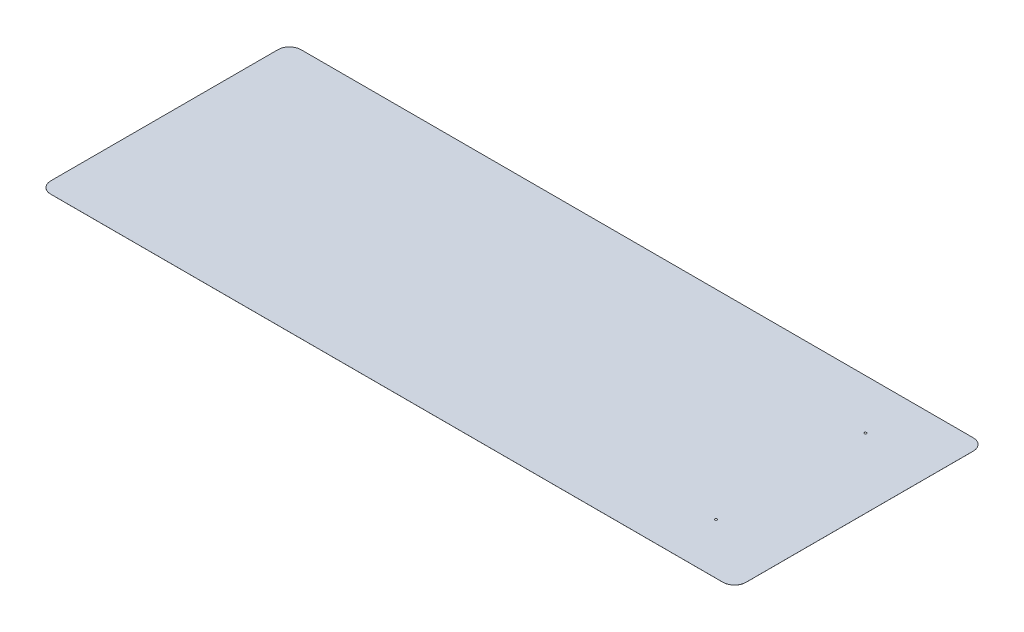
ISO-10303-21;
HEADER;
FILE_DESCRIPTION(('STEP AP214'),'2;1');
FILE_NAME('part.step','',(''),(''),'','','');
FILE_SCHEMA(('AUTOMOTIVE_DESIGN { 1 0 10303 214 1 1 1 1 }'));
ENDSEC;
DATA;
#1=APPLICATION_CONTEXT('core data for automotive mechanical design processes');
#2=APPLICATION_PROTOCOL_DEFINITION('international standard','automotive_design',2000,#1);
#3=PRODUCT_CONTEXT('',#1,'mechanical');
#4=PRODUCT('Part','Part','',(#3));
#5=PRODUCT_RELATED_PRODUCT_CATEGORY('part','',(#4));
#6=PRODUCT_DEFINITION_FORMATION('','',#4);
#7=PRODUCT_DEFINITION_CONTEXT('part definition',#1,'design');
#8=PRODUCT_DEFINITION('design','',#6,#7);
#9=PRODUCT_DEFINITION_SHAPE('','',#8);
#10=(LENGTH_UNIT() NAMED_UNIT(*) SI_UNIT(.MILLI.,.METRE.));
#11=(NAMED_UNIT(*) PLANE_ANGLE_UNIT() SI_UNIT($,.RADIAN.));
#12=(NAMED_UNIT(*) SI_UNIT($,.STERADIAN.) SOLID_ANGLE_UNIT());
#13=UNCERTAINTY_MEASURE_WITH_UNIT(LENGTH_MEASURE(1.E-05),#10,'distance_accuracy_value','');
#14=(GEOMETRIC_REPRESENTATION_CONTEXT(3) GLOBAL_UNCERTAINTY_ASSIGNED_CONTEXT((#13)) GLOBAL_UNIT_ASSIGNED_CONTEXT((#10,
#11,#12)) REPRESENTATION_CONTEXT('',''));
#15=CARTESIAN_POINT('',(0.,0.,0.));
#16=DIRECTION('',(0.,0.,1.));
#17=DIRECTION('',(1.,0.,0.));
#18=AXIS2_PLACEMENT_3D('',#15,#16,#17);
#19=CARTESIAN_POINT('',(-920.75,0.127,311.15));
#20=DIRECTION('',(0.,-1.,0.));
#21=DIRECTION('',(0.,0.,-1.));
#22=AXIS2_PLACEMENT_3D('',#19,#20,#21);
#23=CYLINDRICAL_SURFACE('',#22,31.6932692910022);
#24=CARTESIAN_POINT('',(-920.75,0.,311.15));
#25=DIRECTION('',(0.,1.,0.));
#26=DIRECTION('',(0.,0.,1.));
#27=AXIS2_PLACEMENT_3D('',#24,#25,#26);
#28=CIRCLE('',#27,31.6932692910022);
#29=CARTESIAN_POINT('',(-952.443269291002,0.,311.15));
#30=VERTEX_POINT('',#29);
#31=CARTESIAN_POINT('',(-920.75,0.,342.843269291002));
#32=VERTEX_POINT('',#31);
#33=EDGE_CURVE('E130',#30,#32,#28,.T.);
#34=ORIENTED_EDGE('',*,*,#33,.T.);
#35=DIRECTION('',(0.,-1.,0.));
#36=VECTOR('',#35,1.);
#37=CARTESIAN_POINT('',(-920.75,0.127,342.843269291002));
#38=LINE('',#37,#36);
#39=CARTESIAN_POINT('',(-920.75,0.127,342.843269291002));
#40=VERTEX_POINT('',#39);
#41=EDGE_CURVE('E11',#40,#32,#38,.T.);
#42=ORIENTED_EDGE('',*,*,#41,.F.);
#43=CARTESIAN_POINT('',(-920.75,0.127,311.15));
#44=DIRECTION('',(0.,1.,0.));
#45=DIRECTION('',(0.,0.,1.));
#46=AXIS2_PLACEMENT_3D('',#43,#44,#45);
#47=CIRCLE('',#46,31.6932692910022);
#48=CARTESIAN_POINT('',(-952.443269291002,0.127,311.15));
#49=VERTEX_POINT('',#48);
#50=EDGE_CURVE('E145',#49,#40,#47,.T.);
#51=ORIENTED_EDGE('',*,*,#50,.F.);
#52=DIRECTION('',(0.,-1.,0.));
#53=VECTOR('',#52,1.);
#54=CARTESIAN_POINT('',(-952.443269291002,0.127,311.15));
#55=LINE('',#54,#53);
#56=EDGE_CURVE('E126',#49,#30,#55,.T.);
#57=ORIENTED_EDGE('',*,*,#56,.T.);
#58=EDGE_LOOP('',(#34,#42,#51,#57));
#59=FACE_BOUND('',#58,.T.);
#60=ADVANCED_FACE('F34',(#59),#23,.T.);
#61=CARTESIAN_POINT('',(-920.75,0.127,342.843269291002));
#62=DIRECTION('',(0.,0.,-1.));
#63=DIRECTION('',(-1.,0.,0.));
#64=AXIS2_PLACEMENT_3D('',#61,#62,#63);
#65=PLANE('',#64);
#66=DIRECTION('',(1.,0.,0.));
#67=VECTOR('',#66,1.);
#68=CARTESIAN_POINT('',(-920.75,0.,342.843269291002));
#69=LINE('',#68,#67);
#70=CARTESIAN_POINT('',(920.75,0.,342.843269291002));
#71=VERTEX_POINT('',#70);
#72=EDGE_CURVE('E133',#32,#71,#69,.T.);
#73=ORIENTED_EDGE('',*,*,#72,.T.);
#74=DIRECTION('',(0.,-1.,0.));
#75=VECTOR('',#74,1.);
#76=CARTESIAN_POINT('',(920.75,0.127,342.843269291002));
#77=LINE('',#76,#75);
#78=CARTESIAN_POINT('',(920.75,0.127,342.843269291002));
#79=VERTEX_POINT('',#78);
#80=EDGE_CURVE('E42',#79,#71,#77,.T.);
#81=ORIENTED_EDGE('',*,*,#80,.F.);
#82=DIRECTION('',(1.,0.,0.));
#83=VECTOR('',#82,1.);
#84=CARTESIAN_POINT('',(-920.75,0.127,342.843269291002));
#85=LINE('',#84,#83);
#86=EDGE_CURVE('E93',#40,#79,#85,.T.);
#87=ORIENTED_EDGE('',*,*,#86,.F.);
#88=ORIENTED_EDGE('',*,*,#41,.T.);
#89=EDGE_LOOP('',(#73,#81,#87,#88));
#90=FACE_BOUND('',#89,.T.);
#91=ADVANCED_FACE('F214',(#90),#65,.F.);
#92=CARTESIAN_POINT('',(920.75,0.127,311.15));
#93=DIRECTION('',(0.,-1.,0.));
#94=DIRECTION('',(0.,0.,-1.));
#95=AXIS2_PLACEMENT_3D('',#92,#93,#94);
#96=CYLINDRICAL_SURFACE('',#95,31.6932692910022);
#97=CARTESIAN_POINT('',(920.75,0.,311.15));
#98=DIRECTION('',(0.,1.,0.));
#99=DIRECTION('',(0.,0.,1.));
#100=AXIS2_PLACEMENT_3D('',#97,#98,#99);
#101=CIRCLE('',#100,31.6932692910022);
#102=CARTESIAN_POINT('',(952.443269291002,0.,311.15));
#103=VERTEX_POINT('',#102);
#104=EDGE_CURVE('E136',#71,#103,#101,.T.);
#105=ORIENTED_EDGE('',*,*,#104,.T.);
#106=DIRECTION('',(0.,-1.,0.));
#107=VECTOR('',#106,1.);
#108=CARTESIAN_POINT('',(952.443269291002,0.127,311.15));
#109=LINE('',#108,#107);
#110=CARTESIAN_POINT('',(952.443269291002,0.127,311.15));
#111=VERTEX_POINT('',#110);
#112=EDGE_CURVE('E152',#111,#103,#109,.T.);
#113=ORIENTED_EDGE('',*,*,#112,.F.);
#114=CARTESIAN_POINT('',(920.75,0.127,311.15));
#115=DIRECTION('',(0.,1.,0.));
#116=DIRECTION('',(0.,0.,1.));
#117=AXIS2_PLACEMENT_3D('',#114,#115,#116);
#118=CIRCLE('',#117,31.6932692910022);
#119=EDGE_CURVE('E160',#79,#111,#118,.T.);
#120=ORIENTED_EDGE('',*,*,#119,.F.);
#121=ORIENTED_EDGE('',*,*,#80,.T.);
#122=EDGE_LOOP('',(#105,#113,#120,#121));
#123=FACE_BOUND('',#122,.T.);
#124=ADVANCED_FACE('F158',(#123),#96,.T.);
#125=CARTESIAN_POINT('',(952.443269291002,0.127,311.15));
#126=DIRECTION('',(-1.,0.,0.));
#127=DIRECTION('',(0.,0.,1.));
#128=AXIS2_PLACEMENT_3D('',#125,#126,#127);
#129=PLANE('',#128);
#130=DIRECTION('',(0.,0.,-1.));
#131=VECTOR('',#130,1.);
#132=CARTESIAN_POINT('',(952.443269291002,0.,311.15));
#133=LINE('',#132,#131);
#134=CARTESIAN_POINT('',(952.443269291002,0.,-311.15));
#135=VERTEX_POINT('',#134);
#136=EDGE_CURVE('E138',#103,#135,#133,.T.);
#137=ORIENTED_EDGE('',*,*,#136,.T.);
#138=DIRECTION('',(0.,-1.,0.));
#139=VECTOR('',#138,1.);
#140=CARTESIAN_POINT('',(952.443269291002,0.127,-311.15));
#141=LINE('',#140,#139);
#142=CARTESIAN_POINT('',(952.443269291002,0.127,-311.15));
#143=VERTEX_POINT('',#142);
#144=EDGE_CURVE('E149',#143,#135,#141,.T.);
#145=ORIENTED_EDGE('',*,*,#144,.F.);
#146=DIRECTION('',(0.,0.,-1.));
#147=VECTOR('',#146,1.);
#148=CARTESIAN_POINT('',(952.443269291002,0.127,311.15));
#149=LINE('',#148,#147);
#150=EDGE_CURVE('E172',#111,#143,#149,.T.);
#151=ORIENTED_EDGE('',*,*,#150,.F.);
#152=ORIENTED_EDGE('',*,*,#112,.T.);
#153=EDGE_LOOP('',(#137,#145,#151,#152));
#154=FACE_BOUND('',#153,.T.);
#155=ADVANCED_FACE('F168',(#154),#129,.F.);
#156=CARTESIAN_POINT('',(920.75,0.127,-311.15));
#157=DIRECTION('',(0.,-1.,0.));
#158=DIRECTION('',(0.,0.,-1.));
#159=AXIS2_PLACEMENT_3D('',#156,#157,#158);
#160=CYLINDRICAL_SURFACE('',#159,31.6932692910021);
#161=CARTESIAN_POINT('',(920.75,0.,-311.15));
#162=DIRECTION('',(0.,1.,0.));
#163=DIRECTION('',(0.,0.,1.));
#164=AXIS2_PLACEMENT_3D('',#161,#162,#163);
#165=CIRCLE('',#164,31.6932692910021);
#166=CARTESIAN_POINT('',(920.75,0.,-342.843269291002));
#167=VERTEX_POINT('',#166);
#168=EDGE_CURVE('E140',#135,#167,#165,.T.);
#169=ORIENTED_EDGE('',*,*,#168,.T.);
#170=DIRECTION('',(0.,-1.,0.));
#171=VECTOR('',#170,1.);
#172=CARTESIAN_POINT('',(920.75,0.127,-342.843269291002));
#173=LINE('',#172,#171);
#174=CARTESIAN_POINT('',(920.75,0.127,-342.843269291002));
#175=VERTEX_POINT('',#174);
#176=EDGE_CURVE('E121',#175,#167,#173,.T.);
#177=ORIENTED_EDGE('',*,*,#176,.F.);
#178=CARTESIAN_POINT('',(920.75,0.127,-311.15));
#179=DIRECTION('',(0.,1.,0.));
#180=DIRECTION('',(0.,0.,1.));
#181=AXIS2_PLACEMENT_3D('',#178,#179,#180);
#182=CIRCLE('',#181,31.6932692910021);
#183=EDGE_CURVE('E112',#143,#175,#182,.T.);
#184=ORIENTED_EDGE('',*,*,#183,.F.);
#185=ORIENTED_EDGE('',*,*,#144,.T.);
#186=EDGE_LOOP('',(#169,#177,#184,#185));
#187=FACE_BOUND('',#186,.T.);
#188=ADVANCED_FACE('F171',(#187),#160,.T.);
#189=CARTESIAN_POINT('',(920.75,0.127,-342.843269291002));
#190=DIRECTION('',(0.,0.,1.));
#191=DIRECTION('',(1.,0.,0.));
#192=AXIS2_PLACEMENT_3D('',#189,#190,#191);
#193=PLANE('',#192);
#194=DIRECTION('',(-1.,0.,0.));
#195=VECTOR('',#194,1.);
#196=CARTESIAN_POINT('',(920.75,0.,-342.843269291002));
#197=LINE('',#196,#195);
#198=CARTESIAN_POINT('',(-920.75,0.,-342.843269291002));
#199=VERTEX_POINT('',#198);
#200=EDGE_CURVE('E120',#167,#199,#197,.T.);
#201=ORIENTED_EDGE('',*,*,#200,.T.);
#202=DIRECTION('',(0.,-1.,0.));
#203=VECTOR('',#202,1.);
#204=CARTESIAN_POINT('',(-920.75,0.127,-342.843269291002));
#205=LINE('',#204,#203);
#206=CARTESIAN_POINT('',(-920.75,0.127,-342.843269291002));
#207=VERTEX_POINT('',#206);
#208=EDGE_CURVE('E117',#207,#199,#205,.T.);
#209=ORIENTED_EDGE('',*,*,#208,.F.);
#210=DIRECTION('',(-1.,0.,0.));
#211=VECTOR('',#210,1.);
#212=CARTESIAN_POINT('',(920.75,0.127,-342.843269291002));
#213=LINE('',#212,#211);
#214=EDGE_CURVE('E106',#175,#207,#213,.T.);
#215=ORIENTED_EDGE('',*,*,#214,.F.);
#216=ORIENTED_EDGE('',*,*,#176,.T.);
#217=EDGE_LOOP('',(#201,#209,#215,#216));
#218=FACE_BOUND('',#217,.T.);
#219=ADVANCED_FACE('F118',(#218),#193,.F.);
#220=CARTESIAN_POINT('',(-920.75,0.127,-311.15));
#221=DIRECTION('',(0.,-1.,0.));
#222=DIRECTION('',(0.,0.,-1.));
#223=AXIS2_PLACEMENT_3D('',#220,#221,#222);
#224=CYLINDRICAL_SURFACE('',#223,31.6932692910022);
#225=CARTESIAN_POINT('',(-920.75,0.,-311.15));
#226=DIRECTION('',(0.,1.,0.));
#227=DIRECTION('',(0.,0.,1.));
#228=AXIS2_PLACEMENT_3D('',#225,#226,#227);
#229=CIRCLE('',#228,31.6932692910022);
#230=CARTESIAN_POINT('',(-952.443269291002,0.,-311.15));
#231=VERTEX_POINT('',#230);
#232=EDGE_CURVE('E79',#199,#231,#229,.T.);
#233=ORIENTED_EDGE('',*,*,#232,.T.);
#234=DIRECTION('',(0.,-1.,0.));
#235=VECTOR('',#234,1.);
#236=CARTESIAN_POINT('',(-952.443269291002,0.127,-311.15));
#237=LINE('',#236,#235);
#238=CARTESIAN_POINT('',(-952.443269291002,0.127,-311.15));
#239=VERTEX_POINT('',#238);
#240=EDGE_CURVE('E122',#239,#231,#237,.T.);
#241=ORIENTED_EDGE('',*,*,#240,.F.);
#242=CARTESIAN_POINT('',(-920.75,0.127,-311.15));
#243=DIRECTION('',(0.,1.,0.));
#244=DIRECTION('',(0.,0.,1.));
#245=AXIS2_PLACEMENT_3D('',#242,#243,#244);
#246=CIRCLE('',#245,31.6932692910022);
#247=EDGE_CURVE('E110',#207,#239,#246,.T.);
#248=ORIENTED_EDGE('',*,*,#247,.F.);
#249=ORIENTED_EDGE('',*,*,#208,.T.);
#250=EDGE_LOOP('',(#233,#241,#248,#249));
#251=FACE_BOUND('',#250,.T.);
#252=ADVANCED_FACE('F124',(#251),#224,.T.);
#253=CARTESIAN_POINT('',(-952.443269291002,0.127,-311.15));
#254=DIRECTION('',(1.,0.,0.));
#255=DIRECTION('',(0.,0.,-1.));
#256=AXIS2_PLACEMENT_3D('',#253,#254,#255);
#257=PLANE('',#256);
#258=DIRECTION('',(0.,0.,1.));
#259=VECTOR('',#258,1.);
#260=CARTESIAN_POINT('',(-952.443269291002,0.,-311.15));
#261=LINE('',#260,#259);
#262=EDGE_CURVE('E85',#231,#30,#261,.T.);
#263=ORIENTED_EDGE('',*,*,#262,.T.);
#264=ORIENTED_EDGE('',*,*,#56,.F.);
#265=DIRECTION('',(0.,0.,1.));
#266=VECTOR('',#265,1.);
#267=CARTESIAN_POINT('',(-952.443269291002,0.127,-311.15));
#268=LINE('',#267,#266);
#269=EDGE_CURVE('E50',#239,#49,#268,.T.);
#270=ORIENTED_EDGE('',*,*,#269,.F.);
#271=ORIENTED_EDGE('',*,*,#240,.T.);
#272=EDGE_LOOP('',(#263,#264,#270,#271));
#273=FACE_BOUND('',#272,.T.);
#274=ADVANCED_FACE('F201',(#273),#257,.F.);
#275=CARTESIAN_POINT('',(-920.75,0.127,311.15));
#276=DIRECTION('',(0.,1.,0.));
#277=DIRECTION('',(0.,0.,1.));
#278=AXIS2_PLACEMENT_3D('',#275,#276,#277);
#279=PLANE('',#278);
#280=CARTESIAN_POINT('',(762.,0.127,-206.329615432802));
#281=DIRECTION('',(0.,1.,0.));
#282=DIRECTION('',(0.,0.,1.));
#283=AXIS2_PLACEMENT_3D('',#280,#281,#282);
#284=CIRCLE('',#283,3.17499999999996);
#285=CARTESIAN_POINT('',(762.,0.127,-203.154615432802));
#286=VERTEX_POINT('',#285);
#287=EDGE_CURVE('E184',#286,#286,#284,.T.);
#288=ORIENTED_EDGE('',*,*,#287,.F.);
#289=EDGE_LOOP('',(#288));
#290=FACE_BOUND('',#289,.T.);
#291=CARTESIAN_POINT('',(762.,0.127,203.211346141799));
#292=DIRECTION('',(0.,1.,0.));
#293=DIRECTION('',(0.,0.,1.));
#294=AXIS2_PLACEMENT_3D('',#291,#292,#293);
#295=CIRCLE('',#294,3.17499999999996);
#296=CARTESIAN_POINT('',(762.,0.127,206.386346141799));
#297=VERTEX_POINT('',#296);
#298=EDGE_CURVE('E178',#297,#297,#295,.T.);
#299=ORIENTED_EDGE('',*,*,#298,.F.);
#300=EDGE_LOOP('',(#299));
#301=FACE_BOUND('',#300,.T.);
#302=ORIENTED_EDGE('',*,*,#50,.T.);
#303=ORIENTED_EDGE('',*,*,#86,.T.);
#304=ORIENTED_EDGE('',*,*,#119,.T.);
#305=ORIENTED_EDGE('',*,*,#150,.T.);
#306=ORIENTED_EDGE('',*,*,#183,.T.);
#307=ORIENTED_EDGE('',*,*,#214,.T.);
#308=ORIENTED_EDGE('',*,*,#247,.T.);
#309=ORIENTED_EDGE('',*,*,#269,.T.);
#310=EDGE_LOOP('',(#302,#303,#304,#305,#306,#307,#308,#309));
#311=FACE_BOUND('',#310,.T.);
#312=ADVANCED_FACE('F108',(#290,#301,#311),#279,.T.);
#313=CARTESIAN_POINT('',(-920.75,0.,311.15));
#314=DIRECTION('',(0.,1.,0.));
#315=DIRECTION('',(0.,0.,1.));
#316=AXIS2_PLACEMENT_3D('',#313,#314,#315);
#317=PLANE('',#316);
#318=CARTESIAN_POINT('',(762.,0.,-206.329615432802));
#319=DIRECTION('',(0.,1.,0.));
#320=DIRECTION('',(0.,0.,1.));
#321=AXIS2_PLACEMENT_3D('',#318,#319,#320);
#322=CIRCLE('',#321,3.17499999999996);
#323=CARTESIAN_POINT('',(762.,0.,-203.154615432802));
#324=VERTEX_POINT('',#323);
#325=EDGE_CURVE('E134',#324,#324,#322,.T.);
#326=ORIENTED_EDGE('',*,*,#325,.T.);
#327=EDGE_LOOP('',(#326));
#328=FACE_BOUND('',#327,.T.);
#329=CARTESIAN_POINT('',(762.,0.,203.211346141799));
#330=DIRECTION('',(0.,1.,0.));
#331=DIRECTION('',(0.,0.,1.));
#332=AXIS2_PLACEMENT_3D('',#329,#330,#331);
#333=CIRCLE('',#332,3.17499999999996);
#334=CARTESIAN_POINT('',(762.,0.,206.386346141799));
#335=VERTEX_POINT('',#334);
#336=EDGE_CURVE('E181',#335,#335,#333,.T.);
#337=ORIENTED_EDGE('',*,*,#336,.T.);
#338=EDGE_LOOP('',(#337));
#339=FACE_BOUND('',#338,.T.);
#340=ORIENTED_EDGE('',*,*,#33,.F.);
#341=ORIENTED_EDGE('',*,*,#262,.F.);
#342=ORIENTED_EDGE('',*,*,#232,.F.);
#343=ORIENTED_EDGE('',*,*,#200,.F.);
#344=ORIENTED_EDGE('',*,*,#168,.F.);
#345=ORIENTED_EDGE('',*,*,#136,.F.);
#346=ORIENTED_EDGE('',*,*,#104,.F.);
#347=ORIENTED_EDGE('',*,*,#72,.F.);
#348=EDGE_LOOP('',(#340,#341,#342,#343,#344,#345,#346,#347));
#349=FACE_BOUND('',#348,.T.);
#350=ADVANCED_FACE('F164',(#328,#339,#349),#317,.F.);
#351=CARTESIAN_POINT('',(762.,0.,203.211346141799));
#352=DIRECTION('',(0.,1.,0.));
#353=DIRECTION('',(0.,0.,1.));
#354=AXIS2_PLACEMENT_3D('',#351,#352,#353);
#355=CYLINDRICAL_SURFACE('',#354,3.17499999999996);
#356=ORIENTED_EDGE('',*,*,#336,.F.);
#357=EDGE_LOOP('',(#356));
#358=FACE_BOUND('',#357,.T.);
#359=ORIENTED_EDGE('',*,*,#298,.T.);
#360=EDGE_LOOP('',(#359));
#361=FACE_BOUND('',#360,.T.);
#362=ADVANCED_FACE('F195',(#358,#361),#355,.F.);
#363=CARTESIAN_POINT('',(762.,0.,-206.329615432802));
#364=DIRECTION('',(0.,1.,0.));
#365=DIRECTION('',(0.,0.,1.));
#366=AXIS2_PLACEMENT_3D('',#363,#364,#365);
#367=CYLINDRICAL_SURFACE('',#366,3.17499999999996);
#368=ORIENTED_EDGE('',*,*,#325,.F.);
#369=EDGE_LOOP('',(#368));
#370=FACE_BOUND('',#369,.T.);
#371=ORIENTED_EDGE('',*,*,#287,.T.);
#372=EDGE_LOOP('',(#371));
#373=FACE_BOUND('',#372,.T.);
#374=ADVANCED_FACE('F192',(#370,#373),#367,.F.);
#375=CLOSED_SHELL('',(#60,#91,#124,#155,#188,#219,#252,#274,#312,#350,#362,#374));
#376=MANIFOLD_SOLID_BREP('B2',#375);
#377=ADVANCED_BREP_SHAPE_REPRESENTATION('',(#18,#376),#14);
#378=SHAPE_DEFINITION_REPRESENTATION(#9,#377);
ENDSEC;
END-ISO-10303-21;
